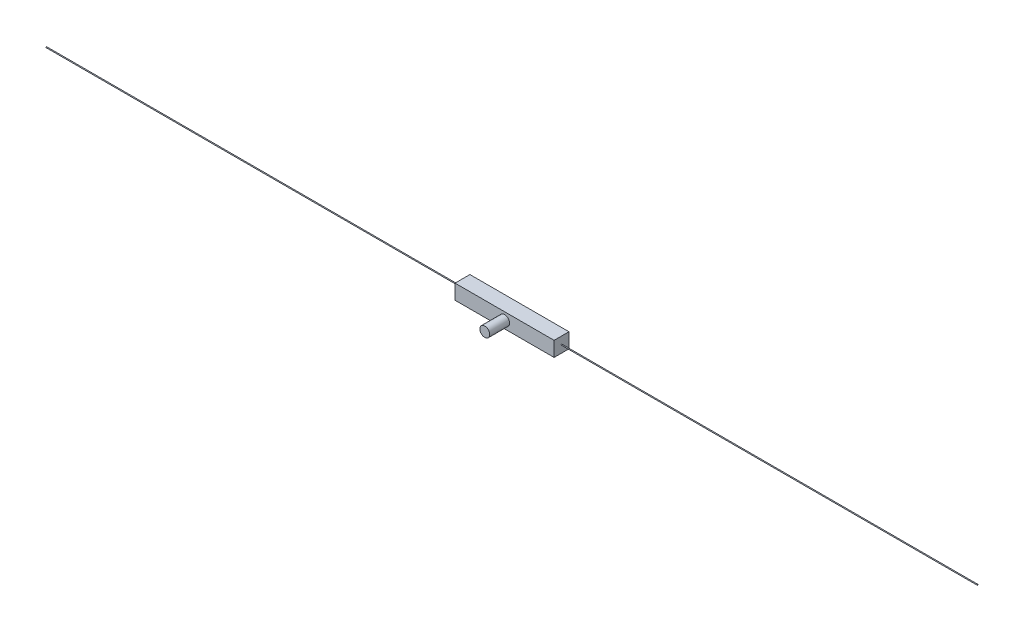
ISO-10303-21;
HEADER;
FILE_DESCRIPTION(('STEP AP214'),'2;1');
FILE_NAME('part.step','',(''),(''),'','','');
FILE_SCHEMA(('AUTOMOTIVE_DESIGN { 1 0 10303 214 1 1 1 1 }'));
ENDSEC;
DATA;
#1=APPLICATION_CONTEXT('core data for automotive mechanical design processes');
#2=APPLICATION_PROTOCOL_DEFINITION('international standard','automotive_design',2000,#1);
#3=PRODUCT_CONTEXT('',#1,'mechanical');
#4=PRODUCT('Part','Part','',(#3));
#5=PRODUCT_RELATED_PRODUCT_CATEGORY('part','',(#4));
#6=PRODUCT_DEFINITION_FORMATION('','',#4);
#7=PRODUCT_DEFINITION_CONTEXT('part definition',#1,'design');
#8=PRODUCT_DEFINITION('design','',#6,#7);
#9=PRODUCT_DEFINITION_SHAPE('','',#8);
#10=(LENGTH_UNIT() NAMED_UNIT(*) SI_UNIT(.MILLI.,.METRE.));
#11=(NAMED_UNIT(*) PLANE_ANGLE_UNIT() SI_UNIT($,.RADIAN.));
#12=(NAMED_UNIT(*) SI_UNIT($,.STERADIAN.) SOLID_ANGLE_UNIT());
#13=UNCERTAINTY_MEASURE_WITH_UNIT(LENGTH_MEASURE(1.E-05),#10,'distance_accuracy_value','');
#14=(GEOMETRIC_REPRESENTATION_CONTEXT(3) GLOBAL_UNCERTAINTY_ASSIGNED_CONTEXT((#13)) GLOBAL_UNIT_ASSIGNED_CONTEXT((#10,
#11,#12)) REPRESENTATION_CONTEXT('',''));
#15=CARTESIAN_POINT('',(0.,0.,0.));
#16=DIRECTION('',(0.,0.,1.));
#17=DIRECTION('',(1.,0.,0.));
#18=AXIS2_PLACEMENT_3D('',#15,#16,#17);
#19=CARTESIAN_POINT('',(0.,0.,15.));
#20=DIRECTION('',(1.,0.,0.));
#21=DIRECTION('',(0.,0.,-1.));
#22=AXIS2_PLACEMENT_3D('',#19,#20,#21);
#23=PLANE('',#22);
#24=DIRECTION('',(0.,-1.,0.));
#25=VECTOR('',#24,1.);
#26=CARTESIAN_POINT('',(0.,0.,0.));
#27=LINE('',#26,#25);
#28=CARTESIAN_POINT('',(0.,15.,0.));
#29=VERTEX_POINT('',#28);
#30=CARTESIAN_POINT('',(0.,0.,0.));
#31=VERTEX_POINT('',#30);
#32=EDGE_CURVE('E103',#29,#31,#27,.T.);
#33=ORIENTED_EDGE('',*,*,#32,.T.);
#34=DIRECTION('',(0.,0.,-1.));
#35=VECTOR('',#34,1.);
#36=CARTESIAN_POINT('',(0.,0.,15.));
#37=LINE('',#36,#35);
#38=CARTESIAN_POINT('',(0.,0.,15.));
#39=VERTEX_POINT('',#38);
#40=EDGE_CURVE('E44',#39,#31,#37,.T.);
#41=ORIENTED_EDGE('',*,*,#40,.F.);
#42=DIRECTION('',(0.,-1.,0.));
#43=VECTOR('',#42,1.);
#44=CARTESIAN_POINT('',(0.,0.,15.));
#45=LINE('',#44,#43);
#46=CARTESIAN_POINT('',(0.,15.,15.));
#47=VERTEX_POINT('',#46);
#48=EDGE_CURVE('E89',#47,#39,#45,.T.);
#49=ORIENTED_EDGE('',*,*,#48,.F.);
#50=DIRECTION('',(0.,0.,-1.));
#51=VECTOR('',#50,1.);
#52=CARTESIAN_POINT('',(0.,15.,15.));
#53=LINE('',#52,#51);
#54=EDGE_CURVE('E99',#47,#29,#53,.T.);
#55=ORIENTED_EDGE('',*,*,#54,.T.);
#56=EDGE_LOOP('',(#33,#41,#49,#55));
#57=FACE_BOUND('',#56,.T.);
#58=CARTESIAN_POINT('',(0.,7.5,7.5));
#59=DIRECTION('',(1.,0.,0.));
#60=DIRECTION('',(0.,0.,-1.));
#61=AXIS2_PLACEMENT_3D('',#58,#59,#60);
#62=CIRCLE('',#61,0.406399999999999);
#63=CARTESIAN_POINT('',(0.,7.5,7.0936));
#64=VERTEX_POINT('',#63);
#65=EDGE_CURVE('E11',#64,#64,#62,.F.);
#66=ORIENTED_EDGE('',*,*,#65,.F.);
#67=EDGE_LOOP('',(#66));
#68=FACE_BOUND('',#67,.T.);
#69=ADVANCED_FACE('F35',(#57,#68),#23,.F.);
#70=CARTESIAN_POINT('',(0.,0.,15.));
#71=DIRECTION('',(0.,0.,-1.));
#72=DIRECTION('',(-1.,0.,0.));
#73=AXIS2_PLACEMENT_3D('',#70,#71,#72);
#74=PLANE('',#73);
#75=ORIENTED_EDGE('',*,*,#48,.T.);
#76=DIRECTION('',(1.,0.,0.));
#77=VECTOR('',#76,1.);
#78=CARTESIAN_POINT('',(0.,0.,15.));
#79=LINE('',#78,#77);
#80=CARTESIAN_POINT('',(100.,0.,15.));
#81=VERTEX_POINT('',#80);
#82=EDGE_CURVE('E83',#39,#81,#79,.T.);
#83=ORIENTED_EDGE('',*,*,#82,.T.);
#84=DIRECTION('',(0.,1.,0.));
#85=VECTOR('',#84,1.);
#86=CARTESIAN_POINT('',(100.,0.,15.));
#87=LINE('',#86,#85);
#88=CARTESIAN_POINT('',(100.,15.,15.));
#89=VERTEX_POINT('',#88);
#90=EDGE_CURVE('E87',#81,#89,#87,.T.);
#91=ORIENTED_EDGE('',*,*,#90,.T.);
#92=DIRECTION('',(-1.,0.,0.));
#93=VECTOR('',#92,1.);
#94=CARTESIAN_POINT('',(0.,15.,15.));
#95=LINE('',#94,#93);
#96=EDGE_CURVE('E52',#89,#47,#95,.T.);
#97=ORIENTED_EDGE('',*,*,#96,.T.);
#98=EDGE_LOOP('',(#75,#83,#91,#97));
#99=FACE_BOUND('',#98,.T.);
#100=CARTESIAN_POINT('',(50.,7.5,15.));
#101=DIRECTION('',(0.,0.,1.));
#102=DIRECTION('',(1.,0.,0.));
#103=AXIS2_PLACEMENT_3D('',#100,#101,#102);
#104=CIRCLE('',#103,5.);
#105=CARTESIAN_POINT('',(55.,7.5,15.));
#106=VERTEX_POINT('',#105);
#107=EDGE_CURVE('E106',#106,#106,#104,.T.);
#108=ORIENTED_EDGE('',*,*,#107,.F.);
#109=EDGE_LOOP('',(#108));
#110=FACE_BOUND('',#109,.T.);
#111=ADVANCED_FACE('F84',(#99,#110),#74,.F.);
#112=CARTESIAN_POINT('',(0.,0.,0.));
#113=DIRECTION('',(0.,0.,-1.));
#114=DIRECTION('',(-1.,0.,0.));
#115=AXIS2_PLACEMENT_3D('',#112,#113,#114);
#116=PLANE('',#115);
#117=ORIENTED_EDGE('',*,*,#32,.F.);
#118=DIRECTION('',(-1.,0.,0.));
#119=VECTOR('',#118,1.);
#120=CARTESIAN_POINT('',(0.,15.,0.));
#121=LINE('',#120,#119);
#122=CARTESIAN_POINT('',(100.,15.,0.));
#123=VERTEX_POINT('',#122);
#124=EDGE_CURVE('E75',#123,#29,#121,.T.);
#125=ORIENTED_EDGE('',*,*,#124,.F.);
#126=DIRECTION('',(0.,1.,0.));
#127=VECTOR('',#126,1.);
#128=CARTESIAN_POINT('',(100.,0.,0.));
#129=LINE('',#128,#127);
#130=CARTESIAN_POINT('',(100.,0.,0.));
#131=VERTEX_POINT('',#130);
#132=EDGE_CURVE('E69',#131,#123,#129,.T.);
#133=ORIENTED_EDGE('',*,*,#132,.F.);
#134=DIRECTION('',(1.,0.,0.));
#135=VECTOR('',#134,1.);
#136=CARTESIAN_POINT('',(0.,0.,0.));
#137=LINE('',#136,#135);
#138=EDGE_CURVE('E94',#31,#131,#137,.T.);
#139=ORIENTED_EDGE('',*,*,#138,.F.);
#140=EDGE_LOOP('',(#117,#125,#133,#139));
#141=FACE_BOUND('',#140,.T.);
#142=ADVANCED_FACE('F116',(#141),#116,.T.);
#143=CARTESIAN_POINT('',(0.,0.,15.));
#144=DIRECTION('',(0.,1.,0.));
#145=DIRECTION('',(0.,0.,1.));
#146=AXIS2_PLACEMENT_3D('',#143,#144,#145);
#147=PLANE('',#146);
#148=ORIENTED_EDGE('',*,*,#138,.T.);
#149=DIRECTION('',(0.,0.,-1.));
#150=VECTOR('',#149,1.);
#151=CARTESIAN_POINT('',(100.,0.,15.));
#152=LINE('',#151,#150);
#153=EDGE_CURVE('E92',#81,#131,#152,.T.);
#154=ORIENTED_EDGE('',*,*,#153,.F.);
#155=ORIENTED_EDGE('',*,*,#82,.F.);
#156=ORIENTED_EDGE('',*,*,#40,.T.);
#157=EDGE_LOOP('',(#148,#154,#155,#156));
#158=FACE_BOUND('',#157,.T.);
#159=ADVANCED_FACE('F93',(#158),#147,.F.);
#160=CARTESIAN_POINT('',(100.,0.,15.));
#161=DIRECTION('',(-1.,0.,0.));
#162=DIRECTION('',(0.,0.,1.));
#163=AXIS2_PLACEMENT_3D('',#160,#161,#162);
#164=PLANE('',#163);
#165=CARTESIAN_POINT('',(100.,7.5,7.5));
#166=DIRECTION('',(-1.,0.,0.));
#167=DIRECTION('',(0.,0.,1.));
#168=AXIS2_PLACEMENT_3D('',#165,#166,#167);
#169=CIRCLE('',#168,0.406399999999999);
#170=CARTESIAN_POINT('',(100.,7.5,7.9064));
#171=VERTEX_POINT('',#170);
#172=EDGE_CURVE('E38',#171,#171,#169,.T.);
#173=ORIENTED_EDGE('',*,*,#172,.T.);
#174=EDGE_LOOP('',(#173));
#175=FACE_BOUND('',#174,.T.);
#176=ORIENTED_EDGE('',*,*,#132,.T.);
#177=DIRECTION('',(0.,0.,-1.));
#178=VECTOR('',#177,1.);
#179=CARTESIAN_POINT('',(100.,15.,15.));
#180=LINE('',#179,#178);
#181=EDGE_CURVE('E95',#89,#123,#180,.T.);
#182=ORIENTED_EDGE('',*,*,#181,.F.);
#183=ORIENTED_EDGE('',*,*,#90,.F.);
#184=ORIENTED_EDGE('',*,*,#153,.T.);
#185=EDGE_LOOP('',(#176,#182,#183,#184));
#186=FACE_BOUND('',#185,.T.);
#187=ADVANCED_FACE('F97',(#175,#186),#164,.F.);
#188=CARTESIAN_POINT('',(0.,15.,15.));
#189=DIRECTION('',(0.,-1.,0.));
#190=DIRECTION('',(0.,0.,-1.));
#191=AXIS2_PLACEMENT_3D('',#188,#189,#190);
#192=PLANE('',#191);
#193=ORIENTED_EDGE('',*,*,#124,.T.);
#194=ORIENTED_EDGE('',*,*,#54,.F.);
#195=ORIENTED_EDGE('',*,*,#96,.F.);
#196=ORIENTED_EDGE('',*,*,#181,.T.);
#197=EDGE_LOOP('',(#193,#194,#195,#196));
#198=FACE_BOUND('',#197,.T.);
#199=ADVANCED_FACE('F148',(#198),#192,.F.);
#200=CARTESIAN_POINT('',(50.,7.5,35.));
#201=DIRECTION('',(0.,0.,-1.));
#202=DIRECTION('',(-1.,0.,0.));
#203=AXIS2_PLACEMENT_3D('',#200,#201,#202);
#204=CYLINDRICAL_SURFACE('',#203,5.);
#205=CARTESIAN_POINT('',(50.,7.5,35.));
#206=DIRECTION('',(0.,0.,1.));
#207=DIRECTION('',(1.,0.,0.));
#208=AXIS2_PLACEMENT_3D('',#205,#206,#207);
#209=CIRCLE('',#208,5.);
#210=CARTESIAN_POINT('',(55.,7.5,35.));
#211=VERTEX_POINT('',#210);
#212=EDGE_CURVE('E233',#211,#211,#209,.T.);
#213=ORIENTED_EDGE('',*,*,#212,.F.);
#214=EDGE_LOOP('',(#213));
#215=FACE_BOUND('',#214,.T.);
#216=ORIENTED_EDGE('',*,*,#107,.T.);
#217=EDGE_LOOP('',(#216));
#218=FACE_BOUND('',#217,.T.);
#219=ADVANCED_FACE('F152',(#215,#218),#204,.T.);
#220=CARTESIAN_POINT('',(0.,0.,35.));
#221=DIRECTION('',(0.,0.,1.));
#222=DIRECTION('',(1.,0.,0.));
#223=AXIS2_PLACEMENT_3D('',#220,#221,#222);
#224=PLANE('',#223);
#225=ORIENTED_EDGE('',*,*,#212,.T.);
#226=EDGE_LOOP('',(#225));
#227=FACE_BOUND('',#226,.T.);
#228=ADVANCED_FACE('F165',(#227),#224,.T.);
#229=CARTESIAN_POINT('',(-420.,7.5,7.5));
#230=DIRECTION('',(1.,0.,0.));
#231=DIRECTION('',(0.,0.,-1.));
#232=AXIS2_PLACEMENT_3D('',#229,#230,#231);
#233=CYLINDRICAL_SURFACE('',#232,0.406399999999999);
#234=CARTESIAN_POINT('',(-420.,7.5,7.5));
#235=DIRECTION('',(-1.,0.,0.));
#236=DIRECTION('',(0.,0.,1.));
#237=AXIS2_PLACEMENT_3D('',#234,#235,#236);
#238=CIRCLE('',#237,0.406399999999999);
#239=CARTESIAN_POINT('',(-420.,7.5,7.9064));
#240=VERTEX_POINT('',#239);
#241=EDGE_CURVE('E229',#240,#240,#238,.T.);
#242=ORIENTED_EDGE('',*,*,#241,.F.);
#243=EDGE_LOOP('',(#242));
#244=FACE_BOUND('',#243,.T.);
#245=ORIENTED_EDGE('',*,*,#65,.T.);
#246=EDGE_LOOP('',(#245));
#247=FACE_BOUND('',#246,.T.);
#248=ADVANCED_FACE('F175',(#244,#247),#233,.T.);
#249=CARTESIAN_POINT('',(-420.,7.5,7.5));
#250=DIRECTION('',(-1.,0.,0.));
#251=DIRECTION('',(0.,0.,1.));
#252=AXIS2_PLACEMENT_3D('',#249,#250,#251);
#253=PLANE('',#252);
#254=ORIENTED_EDGE('',*,*,#241,.T.);
#255=EDGE_LOOP('',(#254));
#256=FACE_BOUND('',#255,.T.);
#257=ADVANCED_FACE('F186',(#256),#253,.T.);
#258=CARTESIAN_POINT('',(520.,7.5,7.5));
#259=DIRECTION('',(-1.,0.,0.));
#260=DIRECTION('',(0.,0.,1.));
#261=AXIS2_PLACEMENT_3D('',#258,#259,#260);
#262=CYLINDRICAL_SURFACE('',#261,0.406399999999999);
#263=CARTESIAN_POINT('',(520.,7.5,7.5));
#264=DIRECTION('',(-1.,0.,0.));
#265=DIRECTION('',(0.,0.,1.));
#266=AXIS2_PLACEMENT_3D('',#263,#264,#265);
#267=CIRCLE('',#266,0.406399999999999);
#268=CARTESIAN_POINT('',(520.,7.5,7.9064));
#269=VERTEX_POINT('',#268);
#270=EDGE_CURVE('E226',#269,#269,#267,.T.);
#271=ORIENTED_EDGE('',*,*,#270,.T.);
#272=EDGE_LOOP('',(#271));
#273=FACE_BOUND('',#272,.T.);
#274=ORIENTED_EDGE('',*,*,#172,.F.);
#275=EDGE_LOOP('',(#274));
#276=FACE_BOUND('',#275,.T.);
#277=ADVANCED_FACE('F194',(#273,#276),#262,.T.);
#278=CARTESIAN_POINT('',(520.,7.5,7.5));
#279=DIRECTION('',(-1.,0.,0.));
#280=DIRECTION('',(0.,0.,1.));
#281=AXIS2_PLACEMENT_3D('',#278,#279,#280);
#282=PLANE('',#281);
#283=ORIENTED_EDGE('',*,*,#270,.F.);
#284=EDGE_LOOP('',(#283));
#285=FACE_BOUND('',#284,.T.);
#286=ADVANCED_FACE('F203',(#285),#282,.F.);
#287=CLOSED_SHELL('',(#69,#111,#142,#159,#187,#199,#219,#228,#248,#257,#277,#286));
#288=MANIFOLD_SOLID_BREP('B2',#287);
#289=ADVANCED_BREP_SHAPE_REPRESENTATION('',(#18,#288),#14);
#290=SHAPE_DEFINITION_REPRESENTATION(#9,#289);
ENDSEC;
END-ISO-10303-21;
